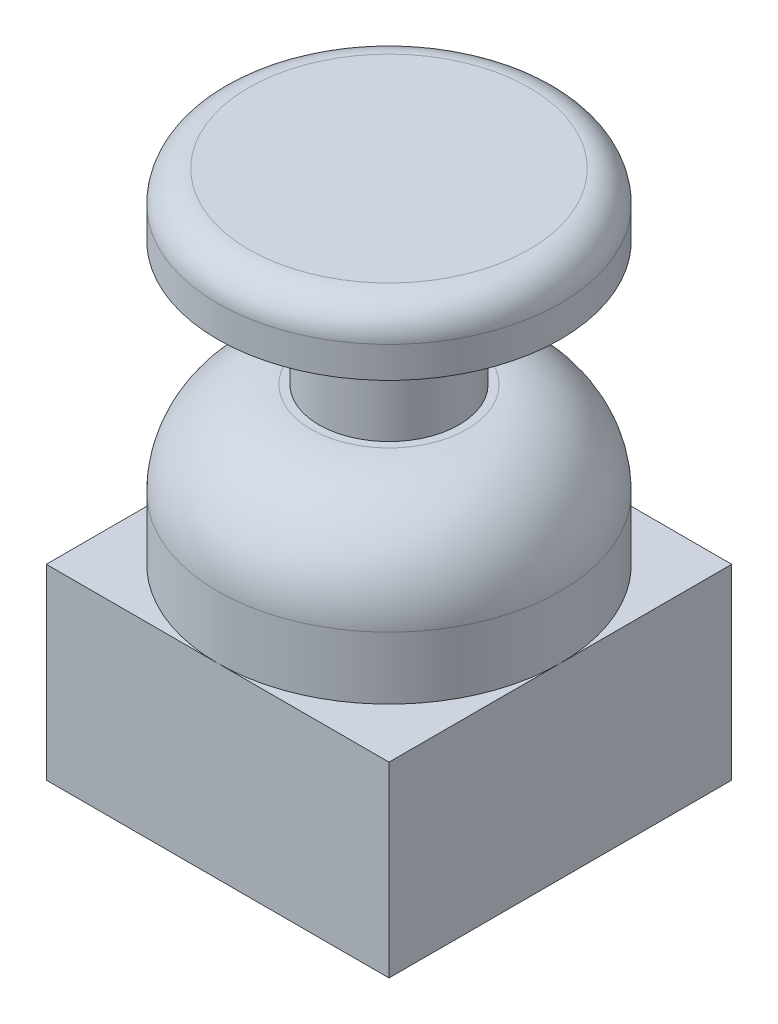
ISO-10303-21;
HEADER;
FILE_DESCRIPTION(('STEP AP214'),'2;1');
FILE_NAME('part.step','',(''),(''),'','','');
FILE_SCHEMA(('AUTOMOTIVE_DESIGN { 1 0 10303 214 1 1 1 1 }'));
ENDSEC;
DATA;
#1=APPLICATION_CONTEXT('core data for automotive mechanical design processes');
#2=APPLICATION_PROTOCOL_DEFINITION('international standard','automotive_design',2000,#1);
#3=PRODUCT_CONTEXT('',#1,'mechanical');
#4=PRODUCT('Part','Part','',(#3));
#5=PRODUCT_RELATED_PRODUCT_CATEGORY('part','',(#4));
#6=PRODUCT_DEFINITION_FORMATION('','',#4);
#7=PRODUCT_DEFINITION_CONTEXT('part definition',#1,'design');
#8=PRODUCT_DEFINITION('design','',#6,#7);
#9=PRODUCT_DEFINITION_SHAPE('','',#8);
#10=(LENGTH_UNIT() NAMED_UNIT(*) SI_UNIT(.MILLI.,.METRE.));
#11=(NAMED_UNIT(*) PLANE_ANGLE_UNIT() SI_UNIT($,.RADIAN.));
#12=(NAMED_UNIT(*) SI_UNIT($,.STERADIAN.) SOLID_ANGLE_UNIT());
#13=UNCERTAINTY_MEASURE_WITH_UNIT(LENGTH_MEASURE(1.E-05),#10,'distance_accuracy_value','');
#14=(GEOMETRIC_REPRESENTATION_CONTEXT(3) GLOBAL_UNCERTAINTY_ASSIGNED_CONTEXT((#13)) GLOBAL_UNIT_ASSIGNED_CONTEXT((#10,
#11,#12)) REPRESENTATION_CONTEXT('',''));
#15=CARTESIAN_POINT('',(0.,0.,0.));
#16=DIRECTION('',(0.,0.,1.));
#17=DIRECTION('',(1.,0.,0.));
#18=AXIS2_PLACEMENT_3D('',#15,#16,#17);
#19=CARTESIAN_POINT('',(0.,34.,0.));
#20=DIRECTION('',(0.,1.,0.));
#21=DIRECTION('',(0.,0.,1.));
#22=AXIS2_PLACEMENT_3D('',#19,#20,#21);
#23=CYLINDRICAL_SURFACE('',#22,11.);
#24=CARTESIAN_POINT('',(0.,12.,0.));
#25=DIRECTION('',(0.,1.,0.));
#26=DIRECTION('',(0.,0.,1.));
#27=AXIS2_PLACEMENT_3D('',#24,#25,#26);
#28=CIRCLE('',#27,11.);
#29=CARTESIAN_POINT('',(0.,12.,11.));
#30=VERTEX_POINT('',#29);
#31=CARTESIAN_POINT('',(-11.,12.,0.));
#32=VERTEX_POINT('',#31);
#33=EDGE_CURVE('E11',#30,#32,#28,.F.);
#34=ORIENTED_EDGE('',*,*,#33,.F.);
#35=CARTESIAN_POINT('',(11.,12.,0.));
#36=VERTEX_POINT('',#35);
#37=EDGE_CURVE('E47',#36,#30,#28,.F.);
#38=ORIENTED_EDGE('',*,*,#37,.F.);
#39=CARTESIAN_POINT('',(0.,12.,-11.));
#40=VERTEX_POINT('',#39);
#41=EDGE_CURVE('E63',#40,#36,#28,.F.);
#42=ORIENTED_EDGE('',*,*,#41,.F.);
#43=EDGE_CURVE('E53',#32,#40,#28,.F.);
#44=ORIENTED_EDGE('',*,*,#43,.F.);
#45=EDGE_LOOP('',(#34,#38,#42,#44));
#46=FACE_BOUND('',#45,.T.);
#47=CARTESIAN_POINT('',(0.,16.,0.));
#48=DIRECTION('',(0.,1.,0.));
#49=DIRECTION('',(0.,0.,1.));
#50=AXIS2_PLACEMENT_3D('',#47,#48,#49);
#51=CIRCLE('',#50,11.);
#52=CARTESIAN_POINT('',(0.,16.,11.));
#53=VERTEX_POINT('',#52);
#54=EDGE_CURVE('E180',#53,#53,#51,.T.);
#55=ORIENTED_EDGE('',*,*,#54,.F.);
#56=EDGE_LOOP('',(#55));
#57=FACE_BOUND('',#56,.T.);
#58=ADVANCED_FACE('F43',(#46,#57),#23,.T.);
#59=CARTESIAN_POINT('',(0.,16.,0.));
#60=DIRECTION('',(0.,1.,0.));
#61=DIRECTION('',(0.,0.,1.));
#62=AXIS2_PLACEMENT_3D('',#59,#60,#61);
#63=DEGENERATE_TOROIDAL_SURFACE('',#62,5.,6.,.T.);
#64=ORIENTED_EDGE('',*,*,#54,.T.);
#65=EDGE_LOOP('',(#64));
#66=FACE_BOUND('',#65,.T.);
#67=CARTESIAN_POINT('',(0.,22.,0.));
#68=DIRECTION('',(0.,1.,0.));
#69=DIRECTION('',(0.,0.,1.));
#70=AXIS2_PLACEMENT_3D('',#67,#68,#69);
#71=CIRCLE('',#70,4.99999999999996);
#72=CARTESIAN_POINT('',(0.,22.,4.99999999999996));
#73=VERTEX_POINT('',#72);
#74=EDGE_CURVE('E177',#73,#73,#71,.T.);
#75=ORIENTED_EDGE('',*,*,#74,.F.);
#76=EDGE_LOOP('',(#75));
#77=FACE_BOUND('',#76,.T.);
#78=ADVANCED_FACE('F209',(#66,#77),#63,.T.);
#79=CARTESIAN_POINT('',(-4.99999999999995,22.,0.));
#80=DIRECTION('',(0.,1.,0.));
#81=DIRECTION('',(0.,0.,1.));
#82=AXIS2_PLACEMENT_3D('',#79,#80,#81);
#83=PLANE('',#82);
#84=ORIENTED_EDGE('',*,*,#74,.T.);
#85=EDGE_LOOP('',(#84));
#86=FACE_BOUND('',#85,.T.);
#87=CARTESIAN_POINT('',(0.,22.,0.));
#88=DIRECTION('',(0.,1.,0.));
#89=DIRECTION('',(0.,0.,1.));
#90=AXIS2_PLACEMENT_3D('',#87,#88,#89);
#91=CIRCLE('',#90,4.5);
#92=CARTESIAN_POINT('',(0.,22.,4.5));
#93=VERTEX_POINT('',#92);
#94=EDGE_CURVE('E173',#93,#93,#91,.T.);
#95=ORIENTED_EDGE('',*,*,#94,.F.);
#96=EDGE_LOOP('',(#95));
#97=FACE_BOUND('',#96,.T.);
#98=ADVANCED_FACE('F215',(#86,#97),#83,.T.);
#99=CARTESIAN_POINT('',(0.,34.,0.));
#100=DIRECTION('',(0.,1.,0.));
#101=DIRECTION('',(0.,0.,1.));
#102=AXIS2_PLACEMENT_3D('',#99,#100,#101);
#103=CYLINDRICAL_SURFACE('',#102,4.5);
#104=ORIENTED_EDGE('',*,*,#94,.T.);
#105=EDGE_LOOP('',(#104));
#106=FACE_BOUND('',#105,.T.);
#107=CARTESIAN_POINT('',(0.,30.,0.));
#108=DIRECTION('',(0.,1.,0.));
#109=DIRECTION('',(0.,0.,1.));
#110=AXIS2_PLACEMENT_3D('',#107,#108,#109);
#111=CIRCLE('',#110,4.5);
#112=CARTESIAN_POINT('',(0.,30.,4.5));
#113=VERTEX_POINT('',#112);
#114=EDGE_CURVE('E169',#113,#113,#111,.T.);
#115=ORIENTED_EDGE('',*,*,#114,.F.);
#116=EDGE_LOOP('',(#115));
#117=FACE_BOUND('',#116,.T.);
#118=ADVANCED_FACE('F220',(#106,#117),#103,.T.);
#119=CARTESIAN_POINT('',(-4.5,30.,0.));
#120=DIRECTION('',(0.,-1.,0.));
#121=DIRECTION('',(0.,0.,-1.));
#122=AXIS2_PLACEMENT_3D('',#119,#120,#121);
#123=PLANE('',#122);
#124=ORIENTED_EDGE('',*,*,#114,.T.);
#125=EDGE_LOOP('',(#124));
#126=FACE_BOUND('',#125,.T.);
#127=CARTESIAN_POINT('',(0.,30.,0.));
#128=DIRECTION('',(0.,1.,0.));
#129=DIRECTION('',(0.,0.,1.));
#130=AXIS2_PLACEMENT_3D('',#127,#128,#129);
#131=CIRCLE('',#130,11.);
#132=CARTESIAN_POINT('',(0.,30.,11.));
#133=VERTEX_POINT('',#132);
#134=EDGE_CURVE('E165',#133,#133,#131,.T.);
#135=ORIENTED_EDGE('',*,*,#134,.F.);
#136=EDGE_LOOP('',(#135));
#137=FACE_BOUND('',#136,.T.);
#138=ADVANCED_FACE('F224',(#126,#137),#123,.T.);
#139=CARTESIAN_POINT('',(0.,34.,0.));
#140=DIRECTION('',(0.,1.,0.));
#141=DIRECTION('',(0.,0.,1.));
#142=AXIS2_PLACEMENT_3D('',#139,#140,#141);
#143=CYLINDRICAL_SURFACE('',#142,11.);
#144=ORIENTED_EDGE('',*,*,#134,.T.);
#145=EDGE_LOOP('',(#144));
#146=FACE_BOUND('',#145,.T.);
#147=CARTESIAN_POINT('',(0.,32.,0.));
#148=DIRECTION('',(0.,1.,0.));
#149=DIRECTION('',(0.,0.,1.));
#150=AXIS2_PLACEMENT_3D('',#147,#148,#149);
#151=CIRCLE('',#150,11.);
#152=CARTESIAN_POINT('',(0.,32.,11.));
#153=VERTEX_POINT('',#152);
#154=EDGE_CURVE('E161',#153,#153,#151,.T.);
#155=ORIENTED_EDGE('',*,*,#154,.F.);
#156=EDGE_LOOP('',(#155));
#157=FACE_BOUND('',#156,.T.);
#158=ADVANCED_FACE('F228',(#146,#157),#143,.T.);
#159=CARTESIAN_POINT('',(0.,32.,0.));
#160=DIRECTION('',(0.,1.,0.));
#161=DIRECTION('',(0.,0.,1.));
#162=AXIS2_PLACEMENT_3D('',#159,#160,#161);
#163=TOROIDAL_SURFACE('',#162,9.,2.);
#164=ORIENTED_EDGE('',*,*,#154,.T.);
#165=EDGE_LOOP('',(#164));
#166=FACE_BOUND('',#165,.T.);
#167=CARTESIAN_POINT('',(0.,34.,0.));
#168=DIRECTION('',(0.,1.,0.));
#169=DIRECTION('',(0.,0.,1.));
#170=AXIS2_PLACEMENT_3D('',#167,#168,#169);
#171=CIRCLE('',#170,8.99999999999998);
#172=CARTESIAN_POINT('',(0.,34.,8.99999999999998));
#173=VERTEX_POINT('',#172);
#174=EDGE_CURVE('E151',#173,#173,#171,.T.);
#175=ORIENTED_EDGE('',*,*,#174,.F.);
#176=EDGE_LOOP('',(#175));
#177=FACE_BOUND('',#176,.T.);
#178=ADVANCED_FACE('F232',(#166,#177),#163,.T.);
#179=CARTESIAN_POINT('',(-8.99999999999998,34.,0.));
#180=DIRECTION('',(0.,1.,0.));
#181=DIRECTION('',(0.,0.,1.));
#182=AXIS2_PLACEMENT_3D('',#179,#180,#181);
#183=PLANE('',#182);
#184=ORIENTED_EDGE('',*,*,#174,.T.);
#185=EDGE_LOOP('',(#184));
#186=FACE_BOUND('',#185,.T.);
#187=ADVANCED_FACE('F236',(#186),#183,.T.);
#188=CARTESIAN_POINT('',(11.,12.,-11.));
#189=DIRECTION('',(1.,0.,0.));
#190=DIRECTION('',(0.,0.,-1.));
#191=AXIS2_PLACEMENT_3D('',#188,#189,#190);
#192=PLANE('',#191);
#193=DIRECTION('',(0.,-1.,0.));
#194=VECTOR('',#193,1.);
#195=CARTESIAN_POINT('',(11.,12.,11.));
#196=LINE('',#195,#194);
#197=CARTESIAN_POINT('',(11.,12.,11.));
#198=VERTEX_POINT('',#197);
#199=CARTESIAN_POINT('',(11.,0.,11.));
#200=VERTEX_POINT('',#199);
#201=EDGE_CURVE('E99',#198,#200,#196,.T.);
#202=ORIENTED_EDGE('',*,*,#201,.T.);
#203=DIRECTION('',(0.,0.,1.));
#204=VECTOR('',#203,1.);
#205=CARTESIAN_POINT('',(11.,0.,-11.));
#206=LINE('',#205,#204);
#207=CARTESIAN_POINT('',(11.,0.,-11.));
#208=VERTEX_POINT('',#207);
#209=EDGE_CURVE('E137',#208,#200,#206,.T.);
#210=ORIENTED_EDGE('',*,*,#209,.F.);
#211=DIRECTION('',(0.,-1.,0.));
#212=VECTOR('',#211,1.);
#213=CARTESIAN_POINT('',(11.,12.,-11.));
#214=LINE('',#213,#212);
#215=CARTESIAN_POINT('',(11.,12.,-11.));
#216=VERTEX_POINT('',#215);
#217=EDGE_CURVE('E147',#216,#208,#214,.T.);
#218=ORIENTED_EDGE('',*,*,#217,.F.);
#219=DIRECTION('',(0.,0.,1.));
#220=VECTOR('',#219,1.);
#221=CARTESIAN_POINT('',(11.,12.,-11.));
#222=LINE('',#221,#220);
#223=EDGE_CURVE('E102',#216,#36,#222,.T.);
#224=ORIENTED_EDGE('',*,*,#223,.T.);
#225=EDGE_CURVE('E95',#36,#198,#222,.T.);
#226=ORIENTED_EDGE('',*,*,#225,.T.);
#227=EDGE_LOOP('',(#202,#210,#218,#224,#226));
#228=FACE_BOUND('',#227,.T.);
#229=ADVANCED_FACE('F97',(#228),#192,.T.);
#230=CARTESIAN_POINT('',(-11.,12.,-11.));
#231=DIRECTION('',(0.,0.,-1.));
#232=DIRECTION('',(-1.,0.,0.));
#233=AXIS2_PLACEMENT_3D('',#230,#231,#232);
#234=PLANE('',#233);
#235=ORIENTED_EDGE('',*,*,#217,.T.);
#236=DIRECTION('',(1.,0.,0.));
#237=VECTOR('',#236,1.);
#238=CARTESIAN_POINT('',(-11.,0.,-11.));
#239=LINE('',#238,#237);
#240=CARTESIAN_POINT('',(-11.,0.,-11.));
#241=VERTEX_POINT('',#240);
#242=EDGE_CURVE('E107',#241,#208,#239,.T.);
#243=ORIENTED_EDGE('',*,*,#242,.F.);
#244=DIRECTION('',(0.,-1.,0.));
#245=VECTOR('',#244,1.);
#246=CARTESIAN_POINT('',(-11.,12.,-11.));
#247=LINE('',#246,#245);
#248=CARTESIAN_POINT('',(-11.,12.,-11.));
#249=VERTEX_POINT('',#248);
#250=EDGE_CURVE('E152',#249,#241,#247,.T.);
#251=ORIENTED_EDGE('',*,*,#250,.F.);
#252=DIRECTION('',(1.,0.,0.));
#253=VECTOR('',#252,1.);
#254=CARTESIAN_POINT('',(-11.,12.,-11.));
#255=LINE('',#254,#253);
#256=EDGE_CURVE('E118',#249,#40,#255,.T.);
#257=ORIENTED_EDGE('',*,*,#256,.T.);
#258=EDGE_CURVE('E133',#40,#216,#255,.T.);
#259=ORIENTED_EDGE('',*,*,#258,.T.);
#260=EDGE_LOOP('',(#235,#243,#251,#257,#259));
#261=FACE_BOUND('',#260,.T.);
#262=ADVANCED_FACE('F198',(#261),#234,.T.);
#263=CARTESIAN_POINT('',(-11.,12.,-11.));
#264=DIRECTION('',(-1.,0.,0.));
#265=DIRECTION('',(0.,0.,1.));
#266=AXIS2_PLACEMENT_3D('',#263,#264,#265);
#267=PLANE('',#266);
#268=ORIENTED_EDGE('',*,*,#250,.T.);
#269=DIRECTION('',(0.,0.,-1.));
#270=VECTOR('',#269,1.);
#271=CARTESIAN_POINT('',(-11.,0.,-11.));
#272=LINE('',#271,#270);
#273=CARTESIAN_POINT('',(-11.,0.,11.));
#274=VERTEX_POINT('',#273);
#275=EDGE_CURVE('E142',#274,#241,#272,.T.);
#276=ORIENTED_EDGE('',*,*,#275,.F.);
#277=DIRECTION('',(0.,-1.,0.));
#278=VECTOR('',#277,1.);
#279=CARTESIAN_POINT('',(-11.,12.,11.));
#280=LINE('',#279,#278);
#281=CARTESIAN_POINT('',(-11.,12.,11.));
#282=VERTEX_POINT('',#281);
#283=EDGE_CURVE('E117',#282,#274,#280,.T.);
#284=ORIENTED_EDGE('',*,*,#283,.F.);
#285=DIRECTION('',(0.,0.,-1.));
#286=VECTOR('',#285,1.);
#287=CARTESIAN_POINT('',(-11.,12.,-11.));
#288=LINE('',#287,#286);
#289=EDGE_CURVE('E128',#282,#32,#288,.T.);
#290=ORIENTED_EDGE('',*,*,#289,.T.);
#291=EDGE_CURVE('E123',#32,#249,#288,.T.);
#292=ORIENTED_EDGE('',*,*,#291,.T.);
#293=EDGE_LOOP('',(#268,#276,#284,#290,#292));
#294=FACE_BOUND('',#293,.T.);
#295=ADVANCED_FACE('F202',(#294),#267,.T.);
#296=CARTESIAN_POINT('',(-11.,12.,11.));
#297=DIRECTION('',(0.,0.,1.));
#298=DIRECTION('',(1.,0.,0.));
#299=AXIS2_PLACEMENT_3D('',#296,#297,#298);
#300=PLANE('',#299);
#301=DIRECTION('',(-1.,0.,0.));
#302=VECTOR('',#301,1.);
#303=CARTESIAN_POINT('',(-11.,0.,11.));
#304=LINE('',#303,#302);
#305=EDGE_CURVE('E114',#200,#274,#304,.T.);
#306=ORIENTED_EDGE('',*,*,#305,.F.);
#307=ORIENTED_EDGE('',*,*,#201,.F.);
#308=DIRECTION('',(-1.,0.,0.));
#309=VECTOR('',#308,1.);
#310=CARTESIAN_POINT('',(-11.,12.,11.));
#311=LINE('',#310,#309);
#312=EDGE_CURVE('E112',#198,#30,#311,.T.);
#313=ORIENTED_EDGE('',*,*,#312,.T.);
#314=EDGE_CURVE('E124',#30,#282,#311,.T.);
#315=ORIENTED_EDGE('',*,*,#314,.T.);
#316=ORIENTED_EDGE('',*,*,#283,.T.);
#317=EDGE_LOOP('',(#306,#307,#313,#315,#316));
#318=FACE_BOUND('',#317,.T.);
#319=ADVANCED_FACE('F111',(#318),#300,.T.);
#320=CARTESIAN_POINT('',(0.,12.,0.));
#321=DIRECTION('',(0.,1.,0.));
#322=DIRECTION('',(0.,0.,1.));
#323=AXIS2_PLACEMENT_3D('',#320,#321,#322);
#324=PLANE('',#323);
#325=ORIENTED_EDGE('',*,*,#314,.F.);
#326=ORIENTED_EDGE('',*,*,#33,.T.);
#327=ORIENTED_EDGE('',*,*,#289,.F.);
#328=EDGE_LOOP('',(#325,#326,#327));
#329=FACE_BOUND('',#328,.T.);
#330=ADVANCED_FACE('F206',(#329),#324,.T.);
#331=ORIENTED_EDGE('',*,*,#291,.F.);
#332=ORIENTED_EDGE('',*,*,#43,.T.);
#333=ORIENTED_EDGE('',*,*,#256,.F.);
#334=EDGE_LOOP('',(#331,#332,#333));
#335=FACE_BOUND('',#334,.T.);
#336=ADVANCED_FACE('F193',(#335),#324,.T.);
#337=ORIENTED_EDGE('',*,*,#258,.F.);
#338=ORIENTED_EDGE('',*,*,#41,.T.);
#339=ORIENTED_EDGE('',*,*,#223,.F.);
#340=EDGE_LOOP('',(#337,#338,#339));
#341=FACE_BOUND('',#340,.T.);
#342=ADVANCED_FACE('F194',(#341),#324,.T.);
#343=ORIENTED_EDGE('',*,*,#225,.F.);
#344=ORIENTED_EDGE('',*,*,#37,.T.);
#345=ORIENTED_EDGE('',*,*,#312,.F.);
#346=EDGE_LOOP('',(#343,#344,#345));
#347=FACE_BOUND('',#346,.T.);
#348=ADVANCED_FACE('F120',(#347),#324,.T.);
#349=CARTESIAN_POINT('',(0.,0.,0.));
#350=DIRECTION('',(0.,-1.,0.));
#351=DIRECTION('',(0.,0.,-1.));
#352=AXIS2_PLACEMENT_3D('',#349,#350,#351);
#353=PLANE('',#352);
#354=ORIENTED_EDGE('',*,*,#209,.T.);
#355=ORIENTED_EDGE('',*,*,#305,.T.);
#356=ORIENTED_EDGE('',*,*,#275,.T.);
#357=ORIENTED_EDGE('',*,*,#242,.T.);
#358=EDGE_LOOP('',(#354,#355,#356,#357));
#359=FACE_BOUND('',#358,.T.);
#360=ADVANCED_FACE('F45',(#359),#353,.T.);
#361=CLOSED_SHELL('',(#58,#78,#98,#118,#138,#158,#178,#187,#229,#262,#295,#319,#330,#336,#342,
#348,#360));
#362=MANIFOLD_SOLID_BREP('B2',#361);
#363=ADVANCED_BREP_SHAPE_REPRESENTATION('',(#18,#362),#14);
#364=SHAPE_DEFINITION_REPRESENTATION(#9,#363);
ENDSEC;
END-ISO-10303-21;
